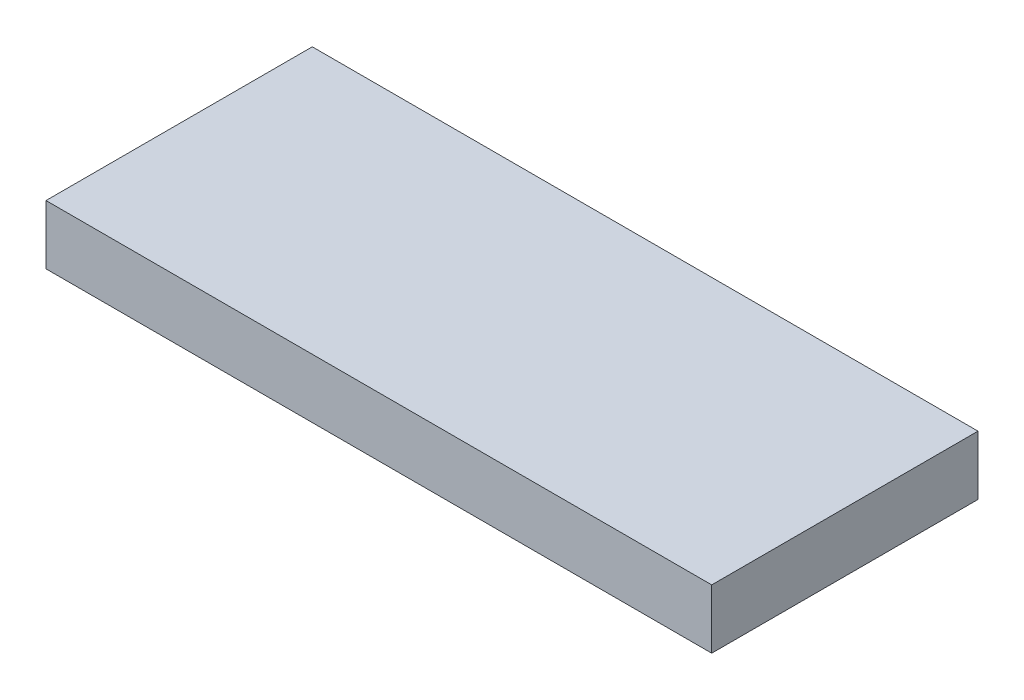
ISO-10303-21;
HEADER;
FILE_DESCRIPTION(('STEP AP214'),'2;1');
FILE_NAME('part.step','',(''),(''),'','','');
FILE_SCHEMA(('AUTOMOTIVE_DESIGN { 1 0 10303 214 1 1 1 1 }'));
ENDSEC;
DATA;
#1=APPLICATION_CONTEXT('core data for automotive mechanical design processes');
#2=APPLICATION_PROTOCOL_DEFINITION('international standard','automotive_design',2000,#1);
#3=PRODUCT_CONTEXT('',#1,'mechanical');
#4=PRODUCT('Part','Part','',(#3));
#5=PRODUCT_RELATED_PRODUCT_CATEGORY('part','',(#4));
#6=PRODUCT_DEFINITION_FORMATION('','',#4);
#7=PRODUCT_DEFINITION_CONTEXT('part definition',#1,'design');
#8=PRODUCT_DEFINITION('design','',#6,#7);
#9=PRODUCT_DEFINITION_SHAPE('','',#8);
#10=(LENGTH_UNIT() NAMED_UNIT(*) SI_UNIT(.MILLI.,.METRE.));
#11=(NAMED_UNIT(*) PLANE_ANGLE_UNIT() SI_UNIT($,.RADIAN.));
#12=(NAMED_UNIT(*) SI_UNIT($,.STERADIAN.) SOLID_ANGLE_UNIT());
#13=UNCERTAINTY_MEASURE_WITH_UNIT(LENGTH_MEASURE(1.E-05),#10,'distance_accuracy_value','');
#14=(GEOMETRIC_REPRESENTATION_CONTEXT(3) GLOBAL_UNCERTAINTY_ASSIGNED_CONTEXT((#13)) GLOBAL_UNIT_ASSIGNED_CONTEXT((#10,
#11,#12)) REPRESENTATION_CONTEXT('',''));
#15=CARTESIAN_POINT('',(0.,0.,0.));
#16=DIRECTION('',(0.,0.,1.));
#17=DIRECTION('',(1.,0.,0.));
#18=AXIS2_PLACEMENT_3D('',#15,#16,#17);
#19=CARTESIAN_POINT('',(225.,40.,90.));
#20=DIRECTION('',(-1.,0.,0.));
#21=DIRECTION('',(0.,0.,1.));
#22=AXIS2_PLACEMENT_3D('',#19,#20,#21);
#23=PLANE('',#22);
#24=DIRECTION('',(0.,0.,-1.));
#25=VECTOR('',#24,1.);
#26=CARTESIAN_POINT('',(225.,0.,90.));
#27=LINE('',#26,#25);
#28=CARTESIAN_POINT('',(225.,0.,90.));
#29=VERTEX_POINT('',#28);
#30=CARTESIAN_POINT('',(225.,0.,-90.));
#31=VERTEX_POINT('',#30);
#32=EDGE_CURVE('E96',#29,#31,#27,.T.);
#33=ORIENTED_EDGE('',*,*,#32,.T.);
#34=DIRECTION('',(0.,-1.,0.));
#35=VECTOR('',#34,1.);
#36=CARTESIAN_POINT('',(225.,40.,-90.));
#37=LINE('',#36,#35);
#38=CARTESIAN_POINT('',(225.,40.,-90.));
#39=VERTEX_POINT('',#38);
#40=EDGE_CURVE('E11',#39,#31,#37,.T.);
#41=ORIENTED_EDGE('',*,*,#40,.F.);
#42=DIRECTION('',(0.,0.,-1.));
#43=VECTOR('',#42,1.);
#44=CARTESIAN_POINT('',(225.,40.,90.));
#45=LINE('',#44,#43);
#46=CARTESIAN_POINT('',(225.,40.,90.));
#47=VERTEX_POINT('',#46);
#48=EDGE_CURVE('E84',#47,#39,#45,.T.);
#49=ORIENTED_EDGE('',*,*,#48,.F.);
#50=DIRECTION('',(0.,-1.,0.));
#51=VECTOR('',#50,1.);
#52=CARTESIAN_POINT('',(225.,40.,90.));
#53=LINE('',#52,#51);
#54=EDGE_CURVE('E92',#47,#29,#53,.T.);
#55=ORIENTED_EDGE('',*,*,#54,.T.);
#56=EDGE_LOOP('',(#33,#41,#49,#55));
#57=FACE_BOUND('',#56,.T.);
#58=ADVANCED_FACE('F33',(#57),#23,.F.);
#59=CARTESIAN_POINT('',(-225.,40.,-90.));
#60=DIRECTION('',(0.,0.,1.));
#61=DIRECTION('',(1.,0.,0.));
#62=AXIS2_PLACEMENT_3D('',#59,#60,#61);
#63=PLANE('',#62);
#64=DIRECTION('',(-1.,0.,0.));
#65=VECTOR('',#64,1.);
#66=CARTESIAN_POINT('',(-225.,0.,-90.));
#67=LINE('',#66,#65);
#68=CARTESIAN_POINT('',(-225.,0.,-90.));
#69=VERTEX_POINT('',#68);
#70=EDGE_CURVE('E88',#31,#69,#67,.T.);
#71=ORIENTED_EDGE('',*,*,#70,.T.);
#72=DIRECTION('',(0.,-1.,0.));
#73=VECTOR('',#72,1.);
#74=CARTESIAN_POINT('',(-225.,40.,-90.));
#75=LINE('',#74,#73);
#76=CARTESIAN_POINT('',(-225.,40.,-90.));
#77=VERTEX_POINT('',#76);
#78=EDGE_CURVE('E41',#77,#69,#75,.T.);
#79=ORIENTED_EDGE('',*,*,#78,.F.);
#80=DIRECTION('',(-1.,0.,0.));
#81=VECTOR('',#80,1.);
#82=CARTESIAN_POINT('',(-225.,40.,-90.));
#83=LINE('',#82,#81);
#84=EDGE_CURVE('E79',#39,#77,#83,.T.);
#85=ORIENTED_EDGE('',*,*,#84,.F.);
#86=ORIENTED_EDGE('',*,*,#40,.T.);
#87=EDGE_LOOP('',(#71,#79,#85,#86));
#88=FACE_BOUND('',#87,.T.);
#89=ADVANCED_FACE('F87',(#88),#63,.F.);
#90=CARTESIAN_POINT('',(-225.,40.,90.));
#91=DIRECTION('',(1.,0.,0.));
#92=DIRECTION('',(0.,0.,-1.));
#93=AXIS2_PLACEMENT_3D('',#90,#91,#92);
#94=PLANE('',#93);
#95=DIRECTION('',(0.,0.,1.));
#96=VECTOR('',#95,1.);
#97=CARTESIAN_POINT('',(-225.,0.,90.));
#98=LINE('',#97,#96);
#99=CARTESIAN_POINT('',(-225.,0.,90.));
#100=VERTEX_POINT('',#99);
#101=EDGE_CURVE('E66',#69,#100,#98,.T.);
#102=ORIENTED_EDGE('',*,*,#101,.T.);
#103=DIRECTION('',(0.,-1.,0.));
#104=VECTOR('',#103,1.);
#105=CARTESIAN_POINT('',(-225.,40.,90.));
#106=LINE('',#105,#104);
#107=CARTESIAN_POINT('',(-225.,40.,90.));
#108=VERTEX_POINT('',#107);
#109=EDGE_CURVE('E89',#108,#100,#106,.T.);
#110=ORIENTED_EDGE('',*,*,#109,.F.);
#111=DIRECTION('',(0.,0.,1.));
#112=VECTOR('',#111,1.);
#113=CARTESIAN_POINT('',(-225.,40.,90.));
#114=LINE('',#113,#112);
#115=EDGE_CURVE('E82',#77,#108,#114,.T.);
#116=ORIENTED_EDGE('',*,*,#115,.F.);
#117=ORIENTED_EDGE('',*,*,#78,.T.);
#118=EDGE_LOOP('',(#102,#110,#116,#117));
#119=FACE_BOUND('',#118,.T.);
#120=ADVANCED_FACE('F90',(#119),#94,.F.);
#121=CARTESIAN_POINT('',(-225.,40.,90.));
#122=DIRECTION('',(0.,0.,-1.));
#123=DIRECTION('',(-1.,0.,0.));
#124=AXIS2_PLACEMENT_3D('',#121,#122,#123);
#125=PLANE('',#124);
#126=DIRECTION('',(1.,0.,0.));
#127=VECTOR('',#126,1.);
#128=CARTESIAN_POINT('',(-225.,0.,90.));
#129=LINE('',#128,#127);
#130=EDGE_CURVE('E72',#100,#29,#129,.T.);
#131=ORIENTED_EDGE('',*,*,#130,.T.);
#132=ORIENTED_EDGE('',*,*,#54,.F.);
#133=DIRECTION('',(1.,0.,0.));
#134=VECTOR('',#133,1.);
#135=CARTESIAN_POINT('',(-225.,40.,90.));
#136=LINE('',#135,#134);
#137=EDGE_CURVE('E49',#108,#47,#136,.T.);
#138=ORIENTED_EDGE('',*,*,#137,.F.);
#139=ORIENTED_EDGE('',*,*,#109,.T.);
#140=EDGE_LOOP('',(#131,#132,#138,#139));
#141=FACE_BOUND('',#140,.T.);
#142=ADVANCED_FACE('F103',(#141),#125,.F.);
#143=CARTESIAN_POINT('',(0.,40.,0.));
#144=DIRECTION('',(0.,-1.,0.));
#145=DIRECTION('',(0.,0.,-1.));
#146=AXIS2_PLACEMENT_3D('',#143,#144,#145);
#147=PLANE('',#146);
#148=ORIENTED_EDGE('',*,*,#48,.T.);
#149=ORIENTED_EDGE('',*,*,#84,.T.);
#150=ORIENTED_EDGE('',*,*,#115,.T.);
#151=ORIENTED_EDGE('',*,*,#137,.T.);
#152=EDGE_LOOP('',(#148,#149,#150,#151));
#153=FACE_BOUND('',#152,.T.);
#154=ADVANCED_FACE('F80',(#153),#147,.F.);
#155=CARTESIAN_POINT('',(0.,0.,0.));
#156=DIRECTION('',(0.,-1.,0.));
#157=DIRECTION('',(0.,0.,-1.));
#158=AXIS2_PLACEMENT_3D('',#155,#156,#157);
#159=PLANE('',#158);
#160=ORIENTED_EDGE('',*,*,#32,.F.);
#161=ORIENTED_EDGE('',*,*,#130,.F.);
#162=ORIENTED_EDGE('',*,*,#101,.F.);
#163=ORIENTED_EDGE('',*,*,#70,.F.);
#164=EDGE_LOOP('',(#160,#161,#162,#163));
#165=FACE_BOUND('',#164,.T.);
#166=ADVANCED_FACE('F106',(#165),#159,.T.);
#167=CLOSED_SHELL('',(#58,#89,#120,#142,#154,#166));
#168=MANIFOLD_SOLID_BREP('B2',#167);
#169=ADVANCED_BREP_SHAPE_REPRESENTATION('',(#18,#168),#14);
#170=SHAPE_DEFINITION_REPRESENTATION(#9,#169);
ENDSEC;
END-ISO-10303-21;
